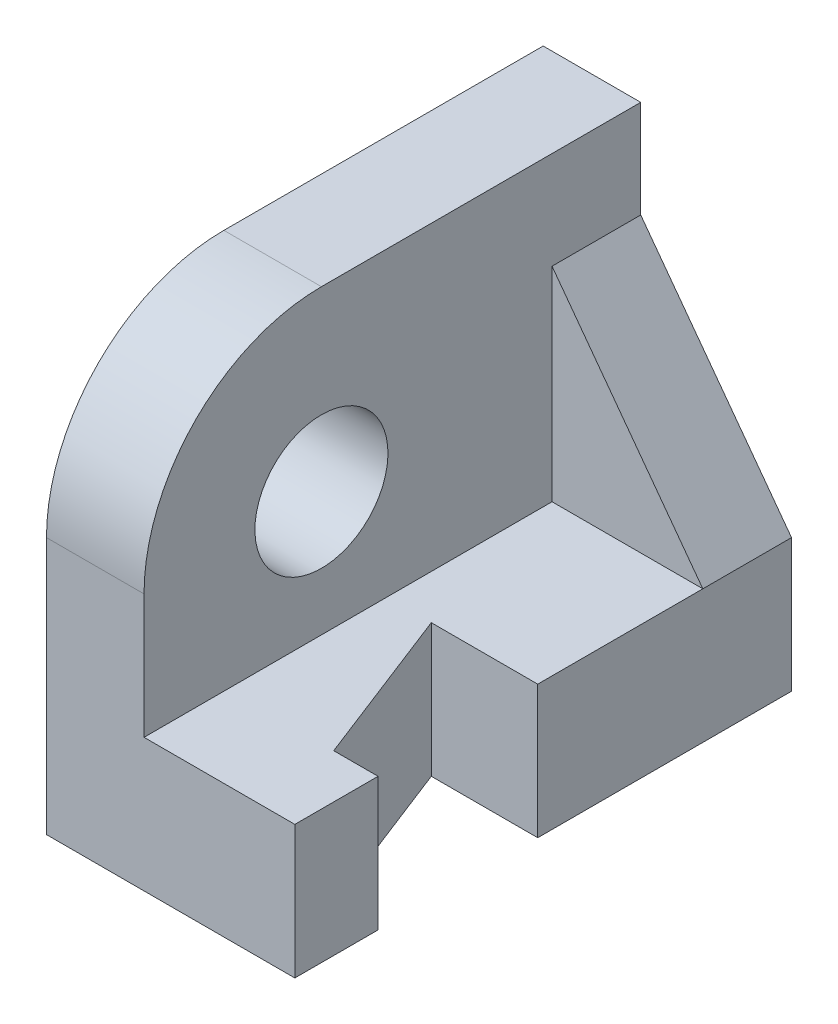
ISO-10303-21;
HEADER;
FILE_DESCRIPTION(('STEP AP214'),'2;1');
FILE_NAME('part.step','',(''),(''),'','','');
FILE_SCHEMA(('AUTOMOTIVE_DESIGN { 1 0 10303 214 1 1 1 1 }'));
ENDSEC;
DATA;
#1=APPLICATION_CONTEXT('core data for automotive mechanical design processes');
#2=APPLICATION_PROTOCOL_DEFINITION('international standard','automotive_design',2000,#1);
#3=PRODUCT_CONTEXT('',#1,'mechanical');
#4=PRODUCT('Part','Part','',(#3));
#5=PRODUCT_RELATED_PRODUCT_CATEGORY('part','',(#4));
#6=PRODUCT_DEFINITION_FORMATION('','',#4);
#7=PRODUCT_DEFINITION_CONTEXT('part definition',#1,'design');
#8=PRODUCT_DEFINITION('design','',#6,#7);
#9=PRODUCT_DEFINITION_SHAPE('','',#8);
#10=(LENGTH_UNIT() NAMED_UNIT(*) SI_UNIT(.MILLI.,.METRE.));
#11=(NAMED_UNIT(*) PLANE_ANGLE_UNIT() SI_UNIT($,.RADIAN.));
#12=(NAMED_UNIT(*) SI_UNIT($,.STERADIAN.) SOLID_ANGLE_UNIT());
#13=UNCERTAINTY_MEASURE_WITH_UNIT(LENGTH_MEASURE(1.E-05),#10,'distance_accuracy_value','');
#14=(GEOMETRIC_REPRESENTATION_CONTEXT(3) GLOBAL_UNCERTAINTY_ASSIGNED_CONTEXT((#13)) GLOBAL_UNIT_ASSIGNED_CONTEXT((#10,
#11,#12)) REPRESENTATION_CONTEXT('',''));
#15=CARTESIAN_POINT('',(0.,0.,0.));
#16=DIRECTION('',(0.,0.,1.));
#17=DIRECTION('',(1.,0.,0.));
#18=AXIS2_PLACEMENT_3D('',#15,#16,#17);
#19=CARTESIAN_POINT('',(-51.0149494119681,-9.30102040816323,56.));
#20=DIRECTION('',(0.,-1.,0.));
#21=DIRECTION('',(0.,0.,-1.));
#22=AXIS2_PLACEMENT_3D('',#19,#20,#21);
#23=PLANE('',#22);
#24=DIRECTION('',(1.,0.,0.));
#25=VECTOR('',#24,1.);
#26=CARTESIAN_POINT('',(-51.0149494119681,-9.30102040816323,10.));
#27=LINE('',#26,#25);
#28=CARTESIAN_POINT('',(-51.0149494119681,-9.30102040816323,10.));
#29=VERTEX_POINT('',#28);
#30=CARTESIAN_POINT('',(-34.0149494119681,-9.30102040816323,10.));
#31=VERTEX_POINT('',#30);
#32=EDGE_CURVE('E262',#29,#31,#27,.T.);
#33=ORIENTED_EDGE('',*,*,#32,.F.);
#34=DIRECTION('',(0.,0.,-1.));
#35=VECTOR('',#34,1.);
#36=CARTESIAN_POINT('',(-51.0149494119681,-9.30102040816323,56.));
#37=LINE('',#36,#35);
#38=CARTESIAN_POINT('',(-51.0149494119681,-9.30102040816323,56.));
#39=VERTEX_POINT('',#38);
#40=EDGE_CURVE('E190',#39,#29,#37,.T.);
#41=ORIENTED_EDGE('',*,*,#40,.F.);
#42=DIRECTION('',(-1.,0.,0.));
#43=VECTOR('',#42,1.);
#44=CARTESIAN_POINT('',(-51.0149494119681,-9.30102040816323,56.));
#45=LINE('',#44,#43);
#46=CARTESIAN_POINT('',(-34.0149494119681,-9.30102040816323,56.));
#47=VERTEX_POINT('',#46);
#48=EDGE_CURVE('E146',#47,#39,#45,.T.);
#49=ORIENTED_EDGE('',*,*,#48,.F.);
#50=DIRECTION('',(0.,0.,-1.));
#51=VECTOR('',#50,1.);
#52=CARTESIAN_POINT('',(-34.0149494119681,-9.30102040816323,56.));
#53=LINE('',#52,#51);
#54=CARTESIAN_POINT('',(-34.0149494119681,-9.30102040816322,46.61326684736));
#55=VERTEX_POINT('',#54);
#56=EDGE_CURVE('E140',#47,#55,#53,.T.);
#57=ORIENTED_EDGE('',*,*,#56,.T.);
#58=DIRECTION('',(1.,0.,0.));
#59=VECTOR('',#58,1.);
#60=CARTESIAN_POINT('',(-51.0149494119681,-9.30102040816323,46.61326684736));
#61=LINE('',#60,#59);
#62=CARTESIAN_POINT('',(-39.0149494119681,-9.30102040816323,46.61326684736));
#63=VERTEX_POINT('',#62);
#64=EDGE_CURVE('E143',#63,#55,#61,.T.);
#65=ORIENTED_EDGE('',*,*,#64,.F.);
#66=DIRECTION('',(0.362446261154949,0.,0.932004671541296));
#67=VECTOR('',#66,1.);
#68=CARTESIAN_POINT('',(-37.4205033604061,-9.30102040816323,50.7132709799481));
#69=LINE('',#68,#67);
#70=CARTESIAN_POINT('',(-46.0149494119681,-9.30102040816323,28.61326684736));
#71=VERTEX_POINT('',#70);
#72=EDGE_CURVE('E54',#71,#63,#69,.T.);
#73=ORIENTED_EDGE('',*,*,#72,.F.);
#74=DIRECTION('',(-1.,0.,0.));
#75=VECTOR('',#74,1.);
#76=CARTESIAN_POINT('',(-51.0149494119681,-9.30102040816323,28.61326684736));
#77=LINE('',#76,#75);
#78=CARTESIAN_POINT('',(-34.0149494119681,-9.30102040816323,28.61326684736));
#79=VERTEX_POINT('',#78);
#80=EDGE_CURVE('E11',#79,#71,#77,.T.);
#81=ORIENTED_EDGE('',*,*,#80,.F.);
#82=EDGE_CURVE('E151',#79,#31,#53,.T.);
#83=ORIENTED_EDGE('',*,*,#82,.T.);
#84=EDGE_LOOP('',(#33,#41,#49,#57,#65,#73,#81,#83));
#85=FACE_BOUND('',#84,.T.);
#86=ADVANCED_FACE('F45',(#85),#23,.F.);
#87=CARTESIAN_POINT('',(-34.0149494119681,-24.3010204081632,56.));
#88=DIRECTION('',(-1.,0.,0.));
#89=DIRECTION('',(0.,0.,1.));
#90=AXIS2_PLACEMENT_3D('',#87,#88,#89);
#91=PLANE('',#90);
#92=DIRECTION('',(0.,-1.,0.));
#93=VECTOR('',#92,1.);
#94=CARTESIAN_POINT('',(-34.0149494119681,107.579875643342,46.61326684736));
#95=LINE('',#94,#93);
#96=CARTESIAN_POINT('',(-34.0149494119681,-24.3010204081632,46.61326684736));
#97=VERTEX_POINT('',#96);
#98=EDGE_CURVE('E155',#55,#97,#95,.T.);
#99=ORIENTED_EDGE('',*,*,#98,.F.);
#100=ORIENTED_EDGE('',*,*,#56,.F.);
#101=DIRECTION('',(0.,1.,0.));
#102=VECTOR('',#101,1.);
#103=CARTESIAN_POINT('',(-34.0149494119681,-24.3010204081632,56.));
#104=LINE('',#103,#102);
#105=CARTESIAN_POINT('',(-34.0149494119681,-24.3010204081632,56.));
#106=VERTEX_POINT('',#105);
#107=EDGE_CURVE('E226',#106,#47,#104,.T.);
#108=ORIENTED_EDGE('',*,*,#107,.F.);
#109=DIRECTION('',(0.,0.,-1.));
#110=VECTOR('',#109,1.);
#111=CARTESIAN_POINT('',(-34.0149494119681,-24.3010204081632,56.));
#112=LINE('',#111,#110);
#113=EDGE_CURVE('E158',#106,#97,#112,.T.);
#114=ORIENTED_EDGE('',*,*,#113,.T.);
#115=EDGE_LOOP('',(#99,#100,#108,#114));
#116=FACE_BOUND('',#115,.T.);
#117=ADVANCED_FACE('F156',(#116),#91,.F.);
#118=CARTESIAN_POINT('',(-51.0149494119681,-24.3010204081632,56.));
#119=DIRECTION('',(0.,1.,0.));
#120=DIRECTION('',(0.,0.,1.));
#121=AXIS2_PLACEMENT_3D('',#118,#119,#120);
#122=PLANE('',#121);
#123=DIRECTION('',(1.,0.,0.));
#124=VECTOR('',#123,1.);
#125=CARTESIAN_POINT('',(-51.0149494119681,-24.3010204081632,0.));
#126=LINE('',#125,#124);
#127=CARTESIAN_POINT('',(-62.0149494119681,-24.3010204081632,0.));
#128=VERTEX_POINT('',#127);
#129=CARTESIAN_POINT('',(-34.0149494119681,-24.3010204081632,0.));
#130=VERTEX_POINT('',#129);
#131=EDGE_CURVE('E212',#128,#130,#126,.T.);
#132=ORIENTED_EDGE('',*,*,#131,.T.);
#133=CARTESIAN_POINT('',(-34.0149494119681,-24.3010204081632,28.61326684736));
#134=VERTEX_POINT('',#133);
#135=EDGE_CURVE('E150',#134,#130,#112,.T.);
#136=ORIENTED_EDGE('',*,*,#135,.F.);
#137=DIRECTION('',(1.,0.,0.));
#138=VECTOR('',#137,1.);
#139=CARTESIAN_POINT('',(-51.0149494119681,-24.3010204081632,28.61326684736));
#140=LINE('',#139,#138);
#141=CARTESIAN_POINT('',(-46.0149494119681,-24.3010204081632,28.61326684736));
#142=VERTEX_POINT('',#141);
#143=EDGE_CURVE('E241',#142,#134,#140,.T.);
#144=ORIENTED_EDGE('',*,*,#143,.F.);
#145=DIRECTION('',(-0.362446261154949,0.,-0.932004671541296));
#146=VECTOR('',#145,1.);
#147=CARTESIAN_POINT('',(-37.4205033604061,-24.3010204081632,50.7132709799481));
#148=LINE('',#147,#146);
#149=CARTESIAN_POINT('',(-39.0149494119681,-24.3010204081632,46.61326684736));
#150=VERTEX_POINT('',#149);
#151=EDGE_CURVE('E245',#150,#142,#148,.T.);
#152=ORIENTED_EDGE('',*,*,#151,.F.);
#153=DIRECTION('',(-1.,0.,0.));
#154=VECTOR('',#153,1.);
#155=CARTESIAN_POINT('',(-51.0149494119681,-24.3010204081632,46.61326684736));
#156=LINE('',#155,#154);
#157=EDGE_CURVE('E249',#97,#150,#156,.T.);
#158=ORIENTED_EDGE('',*,*,#157,.F.);
#159=ORIENTED_EDGE('',*,*,#113,.F.);
#160=DIRECTION('',(1.,0.,0.));
#161=VECTOR('',#160,1.);
#162=CARTESIAN_POINT('',(-62.0149494119681,-24.3010204081632,56.));
#163=LINE('',#162,#161);
#164=CARTESIAN_POINT('',(-62.0149494119681,-24.3010204081632,56.));
#165=VERTEX_POINT('',#164);
#166=EDGE_CURVE('E229',#165,#106,#163,.T.);
#167=ORIENTED_EDGE('',*,*,#166,.F.);
#168=DIRECTION('',(0.,0.,-1.));
#169=VECTOR('',#168,1.);
#170=CARTESIAN_POINT('',(-62.0149494119681,-24.3010204081632,56.));
#171=LINE('',#170,#169);
#172=EDGE_CURVE('E185',#165,#128,#171,.T.);
#173=ORIENTED_EDGE('',*,*,#172,.T.);
#174=EDGE_LOOP('',(#132,#136,#144,#152,#158,#159,#167,#173));
#175=FACE_BOUND('',#174,.T.);
#176=ADVANCED_FACE('F320',(#175),#122,.F.);
#177=CARTESIAN_POINT('',(-62.0149494119681,24.6989795918368,56.));
#178=DIRECTION('',(1.,0.,0.));
#179=DIRECTION('',(0.,0.,-1.));
#180=AXIS2_PLACEMENT_3D('',#177,#178,#179);
#181=PLANE('',#180);
#182=DIRECTION('',(0.,-1.,0.));
#183=VECTOR('',#182,1.);
#184=CARTESIAN_POINT('',(-62.0149494119681,24.6989795918368,0.));
#185=LINE('',#184,#183);
#186=CARTESIAN_POINT('',(-62.0149494119681,24.6989795918368,0.));
#187=VERTEX_POINT('',#186);
#188=EDGE_CURVE('E216',#187,#128,#185,.T.);
#189=ORIENTED_EDGE('',*,*,#188,.T.);
#190=ORIENTED_EDGE('',*,*,#172,.F.);
#191=DIRECTION('',(0.,-1.,0.));
#192=VECTOR('',#191,1.);
#193=CARTESIAN_POINT('',(-62.0149494119681,24.6989795918368,56.));
#194=LINE('',#193,#192);
#195=CARTESIAN_POINT('',(-62.0149494119681,4.69897959183678,56.));
#196=VERTEX_POINT('',#195);
#197=EDGE_CURVE('E205',#196,#165,#194,.T.);
#198=ORIENTED_EDGE('',*,*,#197,.F.);
#199=CARTESIAN_POINT('',(-62.0149494119681,4.69897959183678,36.));
#200=DIRECTION('',(1.,0.,0.));
#201=DIRECTION('',(0.,0.,-1.));
#202=AXIS2_PLACEMENT_3D('',#199,#200,#201);
#203=CIRCLE('',#202,20.);
#204=CARTESIAN_POINT('',(-62.0149494119681,24.6989795918368,36.));
#205=VERTEX_POINT('',#204);
#206=EDGE_CURVE('E178',#196,#205,#203,.F.);
#207=ORIENTED_EDGE('',*,*,#206,.T.);
#208=DIRECTION('',(0.,0.,-1.));
#209=VECTOR('',#208,1.);
#210=CARTESIAN_POINT('',(-62.0149494119681,24.6989795918368,56.));
#211=LINE('',#210,#209);
#212=EDGE_CURVE('E197',#205,#187,#211,.T.);
#213=ORIENTED_EDGE('',*,*,#212,.T.);
#214=EDGE_LOOP('',(#189,#190,#198,#207,#213));
#215=FACE_BOUND('',#214,.T.);
#216=CARTESIAN_POINT('',(-62.0149494119681,4.69897959183678,36.));
#217=DIRECTION('',(1.,0.,0.));
#218=DIRECTION('',(0.,0.,-1.));
#219=AXIS2_PLACEMENT_3D('',#216,#217,#218);
#220=CIRCLE('',#219,7.5);
#221=CARTESIAN_POINT('',(-62.0149494119681,4.69897959183678,28.5));
#222=VERTEX_POINT('',#221);
#223=EDGE_CURVE('E220',#222,#222,#220,.F.);
#224=ORIENTED_EDGE('',*,*,#223,.F.);
#225=EDGE_LOOP('',(#224));
#226=FACE_BOUND('',#225,.T.);
#227=ADVANCED_FACE('F327',(#215,#226),#181,.F.);
#228=DIRECTION('',(0.,0.,1.));
#229=VECTOR('',#228,1.);
#230=CARTESIAN_POINT('',(-34.0149494119681,-9.30102040816323,56.));
#231=LINE('',#230,#229);
#232=CARTESIAN_POINT('',(-34.0149494119681,-9.30102040816323,0.));
#233=VERTEX_POINT('',#232);
#234=EDGE_CURVE('E61',#31,#233,#231,.F.);
#235=ORIENTED_EDGE('',*,*,#234,.F.);
#236=ORIENTED_EDGE('',*,*,#82,.F.);
#237=DIRECTION('',(0.,-1.,0.));
#238=VECTOR('',#237,1.);
#239=CARTESIAN_POINT('',(-34.0149494119681,107.579875643342,28.61326684736));
#240=LINE('',#239,#238);
#241=EDGE_CURVE('E252',#79,#134,#240,.T.);
#242=ORIENTED_EDGE('',*,*,#241,.T.);
#243=ORIENTED_EDGE('',*,*,#135,.T.);
#244=DIRECTION('',(0.,1.,0.));
#245=VECTOR('',#244,1.);
#246=CARTESIAN_POINT('',(-34.0149494119681,-24.3010204081632,0.));
#247=LINE('',#246,#245);
#248=EDGE_CURVE('E209',#130,#233,#247,.T.);
#249=ORIENTED_EDGE('',*,*,#248,.T.);
#250=EDGE_LOOP('',(#235,#236,#242,#243,#249));
#251=FACE_BOUND('',#250,.T.);
#252=ADVANCED_FACE('F322',(#251),#91,.F.);
#253=CARTESIAN_POINT('',(-51.0149494119681,24.6989795918368,56.));
#254=DIRECTION('',(-1.,0.,0.));
#255=DIRECTION('',(0.,-1.,0.));
#256=AXIS2_PLACEMENT_3D('',#253,#254,#255);
#257=PLANE('',#256);
#258=CARTESIAN_POINT('',(-51.0149494119681,4.69897959183678,36.));
#259=DIRECTION('',(1.,0.,0.));
#260=DIRECTION('',(0.,1.,0.));
#261=AXIS2_PLACEMENT_3D('',#258,#259,#260);
#262=CIRCLE('',#261,7.5);
#263=CARTESIAN_POINT('',(-51.0149494119681,12.1989795918368,36.));
#264=VERTEX_POINT('',#263);
#265=EDGE_CURVE('E237',#264,#264,#262,.T.);
#266=ORIENTED_EDGE('',*,*,#265,.F.);
#267=EDGE_LOOP('',(#266));
#268=FACE_BOUND('',#267,.T.);
#269=DIRECTION('',(0.,-1.,0.));
#270=VECTOR('',#269,1.);
#271=CARTESIAN_POINT('',(-51.0149494119681,24.6989795918368,10.));
#272=LINE('',#271,#270);
#273=CARTESIAN_POINT('',(-51.0149494119681,13.6989795918368,10.));
#274=VERTEX_POINT('',#273);
#275=EDGE_CURVE('E69',#274,#29,#272,.T.);
#276=ORIENTED_EDGE('',*,*,#275,.F.);
#277=DIRECTION('',(0.,0.,1.));
#278=VECTOR('',#277,1.);
#279=CARTESIAN_POINT('',(-51.0149494119681,13.6989795918368,56.));
#280=LINE('',#279,#278);
#281=CARTESIAN_POINT('',(-51.0149494119681,13.6989795918368,0.));
#282=VERTEX_POINT('',#281);
#283=EDGE_CURVE('E268',#274,#282,#280,.F.);
#284=ORIENTED_EDGE('',*,*,#283,.T.);
#285=DIRECTION('',(0.,1.,0.));
#286=VECTOR('',#285,1.);
#287=CARTESIAN_POINT('',(-51.0149494119681,24.6989795918368,0.));
#288=LINE('',#287,#286);
#289=CARTESIAN_POINT('',(-51.0149494119681,24.6989795918368,0.));
#290=VERTEX_POINT('',#289);
#291=EDGE_CURVE('E206',#282,#290,#288,.T.);
#292=ORIENTED_EDGE('',*,*,#291,.T.);
#293=DIRECTION('',(0.,0.,-1.));
#294=VECTOR('',#293,1.);
#295=CARTESIAN_POINT('',(-51.0149494119681,24.6989795918368,56.));
#296=LINE('',#295,#294);
#297=CARTESIAN_POINT('',(-51.0149494119681,24.6989795918368,36.));
#298=VERTEX_POINT('',#297);
#299=EDGE_CURVE('E193',#298,#290,#296,.T.);
#300=ORIENTED_EDGE('',*,*,#299,.F.);
#301=CARTESIAN_POINT('',(-51.0149494119681,4.69897959183678,36.));
#302=DIRECTION('',(-1.,0.,0.));
#303=DIRECTION('',(0.,-1.,0.));
#304=AXIS2_PLACEMENT_3D('',#301,#302,#303);
#305=CIRCLE('',#304,20.);
#306=CARTESIAN_POINT('',(-51.0149494119681,4.69897959183678,56.));
#307=VERTEX_POINT('',#306);
#308=EDGE_CURVE('E169',#298,#307,#305,.F.);
#309=ORIENTED_EDGE('',*,*,#308,.T.);
#310=DIRECTION('',(0.,1.,0.));
#311=VECTOR('',#310,1.);
#312=CARTESIAN_POINT('',(-51.0149494119681,24.6989795918368,56.));
#313=LINE('',#312,#311);
#314=EDGE_CURVE('E200',#39,#307,#313,.T.);
#315=ORIENTED_EDGE('',*,*,#314,.F.);
#316=ORIENTED_EDGE('',*,*,#40,.T.);
#317=EDGE_LOOP('',(#276,#284,#292,#300,#309,#315,#316));
#318=FACE_BOUND('',#317,.T.);
#319=ADVANCED_FACE('F290',(#268,#318),#257,.F.);
#320=CARTESIAN_POINT('',(-62.0149494119681,24.6989795918368,56.));
#321=DIRECTION('',(0.,-1.,0.));
#322=DIRECTION('',(1.,0.,0.));
#323=AXIS2_PLACEMENT_3D('',#320,#321,#322);
#324=PLANE('',#323);
#325=DIRECTION('',(-1.,0.,0.));
#326=VECTOR('',#325,1.);
#327=CARTESIAN_POINT('',(-62.0149494119681,24.6989795918368,0.));
#328=LINE('',#327,#326);
#329=EDGE_CURVE('E201',#290,#187,#328,.T.);
#330=ORIENTED_EDGE('',*,*,#329,.T.);
#331=ORIENTED_EDGE('',*,*,#212,.F.);
#332=DIRECTION('',(-1.,0.,0.));
#333=VECTOR('',#332,1.);
#334=CARTESIAN_POINT('',(-51.0149494119681,24.6989795918368,36.));
#335=LINE('',#334,#333);
#336=EDGE_CURVE('E173',#205,#298,#335,.F.);
#337=ORIENTED_EDGE('',*,*,#336,.T.);
#338=ORIENTED_EDGE('',*,*,#299,.T.);
#339=EDGE_LOOP('',(#330,#331,#337,#338));
#340=FACE_BOUND('',#339,.T.);
#341=ADVANCED_FACE('F293',(#340),#324,.F.);
#342=CARTESIAN_POINT('',(0.,0.,56.));
#343=DIRECTION('',(0.,0.,1.));
#344=DIRECTION('',(1.,0.,0.));
#345=AXIS2_PLACEMENT_3D('',#342,#343,#344);
#346=PLANE('',#345);
#347=ORIENTED_EDGE('',*,*,#314,.T.);
#348=DIRECTION('',(-1.,0.,0.));
#349=VECTOR('',#348,1.);
#350=CARTESIAN_POINT('',(-62.0149494119681,4.69897959183678,56.));
#351=LINE('',#350,#349);
#352=EDGE_CURVE('E181',#307,#196,#351,.T.);
#353=ORIENTED_EDGE('',*,*,#352,.T.);
#354=ORIENTED_EDGE('',*,*,#197,.T.);
#355=ORIENTED_EDGE('',*,*,#166,.T.);
#356=ORIENTED_EDGE('',*,*,#107,.T.);
#357=ORIENTED_EDGE('',*,*,#48,.T.);
#358=EDGE_LOOP('',(#347,#353,#354,#355,#356,#357));
#359=FACE_BOUND('',#358,.T.);
#360=ADVANCED_FACE('F300',(#359),#346,.T.);
#361=CARTESIAN_POINT('',(0.,0.,0.));
#362=DIRECTION('',(0.,0.,1.));
#363=DIRECTION('',(1.,0.,0.));
#364=AXIS2_PLACEMENT_3D('',#361,#362,#363);
#365=PLANE('',#364);
#366=ORIENTED_EDGE('',*,*,#291,.F.);
#367=DIRECTION('',(-0.594391061083806,0.804176141466326,0.));
#368=VECTOR('',#367,1.);
#369=CARTESIAN_POINT('',(-34.0149494119681,-9.30102040816323,0.));
#370=LINE('',#369,#368);
#371=EDGE_CURVE('E271',#233,#282,#370,.T.);
#372=ORIENTED_EDGE('',*,*,#371,.F.);
#373=ORIENTED_EDGE('',*,*,#248,.F.);
#374=ORIENTED_EDGE('',*,*,#131,.F.);
#375=ORIENTED_EDGE('',*,*,#188,.F.);
#376=ORIENTED_EDGE('',*,*,#329,.F.);
#377=EDGE_LOOP('',(#366,#372,#373,#374,#375,#376));
#378=FACE_BOUND('',#377,.T.);
#379=ADVANCED_FACE('F285',(#378),#365,.F.);
#380=CARTESIAN_POINT('',(0.,4.6989795918368,36.));
#381=DIRECTION('',(1.,0.,0.));
#382=DIRECTION('',(0.,1.,0.));
#383=AXIS2_PLACEMENT_3D('',#380,#381,#382);
#384=CYLINDRICAL_SURFACE('',#383,20.);
#385=ORIENTED_EDGE('',*,*,#308,.F.);
#386=ORIENTED_EDGE('',*,*,#336,.F.);
#387=ORIENTED_EDGE('',*,*,#206,.F.);
#388=ORIENTED_EDGE('',*,*,#352,.F.);
#389=EDGE_LOOP('',(#385,#386,#387,#388));
#390=FACE_BOUND('',#389,.T.);
#391=ADVANCED_FACE('F47',(#390),#384,.T.);
#392=CARTESIAN_POINT('',(-62.0159494119681,4.69897959183678,36.));
#393=DIRECTION('',(1.,0.,0.));
#394=DIRECTION('',(0.,1.,0.));
#395=AXIS2_PLACEMENT_3D('',#392,#393,#394);
#396=CYLINDRICAL_SURFACE('',#395,7.5);
#397=ORIENTED_EDGE('',*,*,#265,.T.);
#398=EDGE_LOOP('',(#397));
#399=FACE_BOUND('',#398,.T.);
#400=ORIENTED_EDGE('',*,*,#223,.T.);
#401=EDGE_LOOP('',(#400));
#402=FACE_BOUND('',#401,.T.);
#403=ADVANCED_FACE('F337',(#399,#402),#396,.F.);
#404=CARTESIAN_POINT('',(-34.0149494119681,107.579875643342,28.61326684736));
#405=DIRECTION('',(0.,0.,1.));
#406=DIRECTION('',(1.,0.,0.));
#407=AXIS2_PLACEMENT_3D('',#404,#405,#406);
#408=PLANE('',#407);
#409=DIRECTION('',(0.,-1.,0.));
#410=VECTOR('',#409,1.);
#411=CARTESIAN_POINT('',(-46.0149494119681,107.579875643342,28.61326684736));
#412=LINE('',#411,#410);
#413=EDGE_CURVE('E162',#71,#142,#412,.T.);
#414=ORIENTED_EDGE('',*,*,#413,.T.);
#415=ORIENTED_EDGE('',*,*,#143,.T.);
#416=ORIENTED_EDGE('',*,*,#241,.F.);
#417=ORIENTED_EDGE('',*,*,#80,.T.);
#418=EDGE_LOOP('',(#414,#415,#416,#417));
#419=FACE_BOUND('',#418,.T.);
#420=ADVANCED_FACE('F339',(#419),#408,.T.);
#421=CARTESIAN_POINT('',(-46.0149494119681,107.579875643342,28.61326684736));
#422=DIRECTION('',(0.932004671541296,0.,-0.362446261154949));
#423=DIRECTION('',(-0.362446261154949,0.,-0.932004671541296));
#424=AXIS2_PLACEMENT_3D('',#421,#422,#423);
#425=PLANE('',#424);
#426=DIRECTION('',(0.,-1.,0.));
#427=VECTOR('',#426,1.);
#428=CARTESIAN_POINT('',(-39.0149494119681,107.579875643342,46.61326684736));
#429=LINE('',#428,#427);
#430=EDGE_CURVE('E163',#63,#150,#429,.T.);
#431=ORIENTED_EDGE('',*,*,#430,.T.);
#432=ORIENTED_EDGE('',*,*,#151,.T.);
#433=ORIENTED_EDGE('',*,*,#413,.F.);
#434=ORIENTED_EDGE('',*,*,#72,.T.);
#435=EDGE_LOOP('',(#431,#432,#433,#434));
#436=FACE_BOUND('',#435,.T.);
#437=ADVANCED_FACE('F312',(#436),#425,.T.);
#438=CARTESIAN_POINT('',(-39.0149494119681,107.579875643342,46.61326684736));
#439=DIRECTION('',(0.,0.,-1.));
#440=DIRECTION('',(-1.,0.,0.));
#441=AXIS2_PLACEMENT_3D('',#438,#439,#440);
#442=PLANE('',#441);
#443=ORIENTED_EDGE('',*,*,#98,.T.);
#444=ORIENTED_EDGE('',*,*,#157,.T.);
#445=ORIENTED_EDGE('',*,*,#430,.F.);
#446=ORIENTED_EDGE('',*,*,#64,.T.);
#447=EDGE_LOOP('',(#443,#444,#445,#446));
#448=FACE_BOUND('',#447,.T.);
#449=ADVANCED_FACE('F166',(#448),#442,.T.);
#450=CARTESIAN_POINT('',(-48.0149494119681,0.198979591836774,10.));
#451=DIRECTION('',(0.,0.,-1.));
#452=DIRECTION('',(-1.,0.,0.));
#453=AXIS2_PLACEMENT_3D('',#450,#451,#452);
#454=PLANE('',#453);
#455=DIRECTION('',(-0.594391061083806,0.804176141466326,0.));
#456=VECTOR('',#455,1.);
#457=CARTESIAN_POINT('',(-34.0149494119681,-9.30102040816323,10.));
#458=LINE('',#457,#456);
#459=EDGE_CURVE('E272',#31,#274,#458,.T.);
#460=ORIENTED_EDGE('',*,*,#459,.T.);
#461=ORIENTED_EDGE('',*,*,#275,.T.);
#462=ORIENTED_EDGE('',*,*,#32,.T.);
#463=EDGE_LOOP('',(#460,#461,#462));
#464=FACE_BOUND('',#463,.T.);
#465=ADVANCED_FACE('F303',(#464),#454,.F.);
#466=CARTESIAN_POINT('',(-34.0149494119681,-9.30102040816323,0.));
#467=DIRECTION('',(-0.804176141466326,-0.594391061083806,0.));
#468=DIRECTION('',(-0.594391061083806,0.804176141466326,0.));
#469=AXIS2_PLACEMENT_3D('',#466,#467,#468);
#470=PLANE('',#469);
#471=ORIENTED_EDGE('',*,*,#459,.F.);
#472=ORIENTED_EDGE('',*,*,#234,.T.);
#473=ORIENTED_EDGE('',*,*,#371,.T.);
#474=ORIENTED_EDGE('',*,*,#283,.F.);
#475=EDGE_LOOP('',(#471,#472,#473,#474));
#476=FACE_BOUND('',#475,.T.);
#477=ADVANCED_FACE('F281',(#476),#470,.F.);
#478=CLOSED_SHELL('',(#86,#117,#176,#227,#252,#319,#341,#360,#379,#391,#403,#420,#437,#449,#465,#477));
#479=MANIFOLD_SOLID_BREP('B2',#478);
#480=ADVANCED_BREP_SHAPE_REPRESENTATION('',(#18,#479),#14);
#481=SHAPE_DEFINITION_REPRESENTATION(#9,#480);
ENDSEC;
END-ISO-10303-21;
